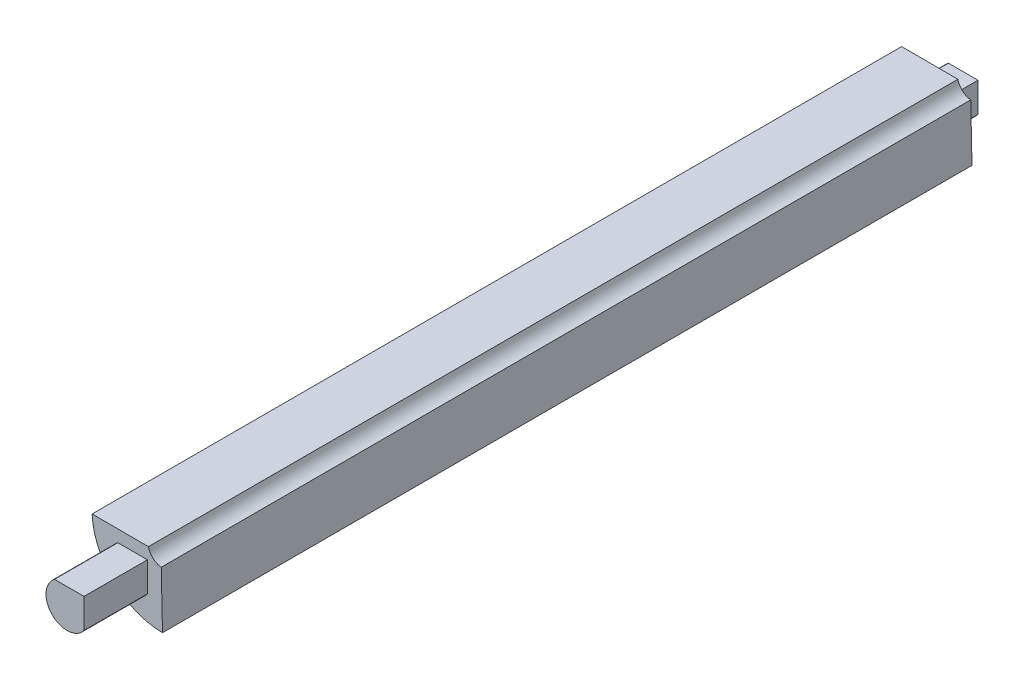
ISO-10303-21;
HEADER;
FILE_DESCRIPTION(('STEP AP214'),'2;1');
FILE_NAME('part.step','',(''),(''),'','','');
FILE_SCHEMA(('AUTOMOTIVE_DESIGN { 1 0 10303 214 1 1 1 1 }'));
ENDSEC;
DATA;
#1=APPLICATION_CONTEXT('core data for automotive mechanical design processes');
#2=APPLICATION_PROTOCOL_DEFINITION('international standard','automotive_design',2000,#1);
#3=PRODUCT_CONTEXT('',#1,'mechanical');
#4=PRODUCT('Part','Part','',(#3));
#5=PRODUCT_RELATED_PRODUCT_CATEGORY('part','',(#4));
#6=PRODUCT_DEFINITION_FORMATION('','',#4);
#7=PRODUCT_DEFINITION_CONTEXT('part definition',#1,'design');
#8=PRODUCT_DEFINITION('design','',#6,#7);
#9=PRODUCT_DEFINITION_SHAPE('','',#8);
#10=(LENGTH_UNIT() NAMED_UNIT(*) SI_UNIT(.MILLI.,.METRE.));
#11=(NAMED_UNIT(*) PLANE_ANGLE_UNIT() SI_UNIT($,.RADIAN.));
#12=(NAMED_UNIT(*) SI_UNIT($,.STERADIAN.) SOLID_ANGLE_UNIT());
#13=UNCERTAINTY_MEASURE_WITH_UNIT(LENGTH_MEASURE(1.E-05),#10,'distance_accuracy_value','');
#14=(GEOMETRIC_REPRESENTATION_CONTEXT(3) GLOBAL_UNCERTAINTY_ASSIGNED_CONTEXT((#13)) GLOBAL_UNIT_ASSIGNED_CONTEXT((#10,
#11,#12)) REPRESENTATION_CONTEXT('',''));
#15=CARTESIAN_POINT('',(0.,0.,0.));
#16=DIRECTION('',(0.,0.,1.));
#17=DIRECTION('',(1.,0.,0.));
#18=AXIS2_PLACEMENT_3D('',#15,#16,#17);
#19=CARTESIAN_POINT('',(4.71363380316695,5.0792632289725,115.));
#20=DIRECTION('',(0.,0.,-1.));
#21=DIRECTION('',(-1.,0.,0.));
#22=AXIS2_PLACEMENT_3D('',#19,#20,#21);
#23=CYLINDRICAL_SURFACE('',#22,10.0492851330422);
#24=CARTESIAN_POINT('',(4.71363380316695,5.0792632289725,0.));
#25=DIRECTION('',(0.,0.,-1.));
#26=DIRECTION('',(-1.,0.,0.));
#27=AXIS2_PLACEMENT_3D('',#24,#25,#26);
#28=CIRCLE('',#27,10.0492851330422);
#29=CARTESIAN_POINT('',(4.67379088573127,-4.96994292012771,0.));
#30=VERTEX_POINT('',#29);
#31=CARTESIAN_POINT('',(-5.32620911426883,4.6437338058589,0.));
#32=VERTEX_POINT('',#31);
#33=EDGE_CURVE('E178',#30,#32,#28,.T.);
#34=ORIENTED_EDGE('',*,*,#33,.F.);
#35=DIRECTION('',(0.,0.,-1.));
#36=VECTOR('',#35,1.);
#37=CARTESIAN_POINT('',(4.67379088573127,-4.96994292012771,115.));
#38=LINE('',#37,#36);
#39=CARTESIAN_POINT('',(4.67379088573127,-4.96994292012771,115.));
#40=VERTEX_POINT('',#39);
#41=EDGE_CURVE('E208',#40,#30,#38,.T.);
#42=ORIENTED_EDGE('',*,*,#41,.F.);
#43=CARTESIAN_POINT('',(4.71363380316695,5.0792632289725,115.));
#44=DIRECTION('',(0.,0.,-1.));
#45=DIRECTION('',(-1.,0.,0.));
#46=AXIS2_PLACEMENT_3D('',#43,#44,#45);
#47=CIRCLE('',#46,10.0492851330422);
#48=CARTESIAN_POINT('',(-5.32620911426883,4.6437338058589,115.));
#49=VERTEX_POINT('',#48);
#50=EDGE_CURVE('E179',#40,#49,#47,.T.);
#51=ORIENTED_EDGE('',*,*,#50,.T.);
#52=DIRECTION('',(0.,0.,-1.));
#53=VECTOR('',#52,1.);
#54=CARTESIAN_POINT('',(-5.32620911426883,4.6437338058589,115.));
#55=LINE('',#54,#53);
#56=EDGE_CURVE('E194',#49,#32,#55,.T.);
#57=ORIENTED_EDGE('',*,*,#56,.T.);
#58=EDGE_LOOP('',(#34,#42,#51,#57));
#59=FACE_BOUND('',#58,.T.);
#60=ADVANCED_FACE('F45',(#59),#23,.T.);
#61=CARTESIAN_POINT('',(4.67379088573127,-4.96994292012771,115.));
#62=DIRECTION('',(-0.999746551843943,-0.0225129313094721,0.));
#63=DIRECTION('',(0.0225129313094721,-0.999746551843944,0.));
#64=AXIS2_PLACEMENT_3D('',#61,#62,#63);
#65=PLANE('',#64);
#66=DIRECTION('',(-0.0225129313094721,0.999746551843944,0.));
#67=VECTOR('',#66,1.);
#68=CARTESIAN_POINT('',(4.67379088573127,-4.96994292012771,0.));
#69=LINE('',#68,#67);
#70=CARTESIAN_POINT('',(4.49430607652267,3.00055708487017,0.));
#71=VERTEX_POINT('',#70);
#72=EDGE_CURVE('E184',#30,#71,#69,.T.);
#73=ORIENTED_EDGE('',*,*,#72,.T.);
#74=DIRECTION('',(0.,0.,-1.));
#75=VECTOR('',#74,1.);
#76=CARTESIAN_POINT('',(4.49430607652267,3.00055708487017,115.));
#77=LINE('',#76,#75);
#78=CARTESIAN_POINT('',(4.49430607652267,3.00055708487017,115.));
#79=VERTEX_POINT('',#78);
#80=EDGE_CURVE('E212',#79,#71,#77,.T.);
#81=ORIENTED_EDGE('',*,*,#80,.F.);
#82=DIRECTION('',(-0.0225129313094721,0.999746551843944,0.));
#83=VECTOR('',#82,1.);
#84=CARTESIAN_POINT('',(4.67379088573127,-4.96994292012771,115.));
#85=LINE('',#84,#83);
#86=EDGE_CURVE('E191',#40,#79,#85,.T.);
#87=ORIENTED_EDGE('',*,*,#86,.F.);
#88=ORIENTED_EDGE('',*,*,#41,.T.);
#89=EDGE_LOOP('',(#73,#81,#87,#88));
#90=FACE_BOUND('',#89,.T.);
#91=ADVANCED_FACE('F256',(#90),#65,.F.);
#92=CARTESIAN_POINT('',(4.71363380316695,5.0792632289725,115.));
#93=DIRECTION('',(0.,0.,-1.));
#94=DIRECTION('',(-1.,0.,0.));
#95=AXIS2_PLACEMENT_3D('',#92,#93,#94);
#96=CYLINDRICAL_SURFACE('',#95,2.09024493426099);
#97=CARTESIAN_POINT('',(4.71363380316695,5.0792632289725,0.));
#98=DIRECTION('',(0.,0.,-1.));
#99=DIRECTION('',(-1.,0.,0.));
#100=AXIS2_PLACEMENT_3D('',#97,#98,#99);
#101=CIRCLE('',#100,2.09024493426099);
#102=CARTESIAN_POINT('',(2.67376435620369,4.62313109400549,0.));
#103=VERTEX_POINT('',#102);
#104=EDGE_CURVE('E202',#71,#103,#101,.T.);
#105=ORIENTED_EDGE('',*,*,#104,.T.);
#106=DIRECTION('',(0.,0.,-1.));
#107=VECTOR('',#106,1.);
#108=CARTESIAN_POINT('',(2.67376435620369,4.62313109400549,115.));
#109=LINE('',#108,#107);
#110=CARTESIAN_POINT('',(2.67376435620369,4.62313109400549,115.));
#111=VERTEX_POINT('',#110);
#112=EDGE_CURVE('E216',#111,#103,#109,.T.);
#113=ORIENTED_EDGE('',*,*,#112,.F.);
#114=CARTESIAN_POINT('',(4.71363380316695,5.0792632289725,115.));
#115=DIRECTION('',(0.,0.,-1.));
#116=DIRECTION('',(-1.,0.,0.));
#117=AXIS2_PLACEMENT_3D('',#114,#115,#116);
#118=CIRCLE('',#117,2.09024493426099);
#119=EDGE_CURVE('E188',#79,#111,#118,.T.);
#120=ORIENTED_EDGE('',*,*,#119,.F.);
#121=ORIENTED_EDGE('',*,*,#80,.T.);
#122=EDGE_LOOP('',(#105,#113,#120,#121));
#123=FACE_BOUND('',#122,.T.);
#124=ADVANCED_FACE('F253',(#123),#96,.F.);
#125=CARTESIAN_POINT('',(-5.32620911426883,4.6437338058589,115.));
#126=DIRECTION('',(0.00257533898167573,0.999996683809066,0.));
#127=DIRECTION('',(-0.999996683809066,0.00257533898167573,0.));
#128=AXIS2_PLACEMENT_3D('',#125,#126,#127);
#129=PLANE('',#128);
#130=DIRECTION('',(0.999996683809066,-0.00257533898167573,0.));
#131=VECTOR('',#130,1.);
#132=CARTESIAN_POINT('',(-5.32620911426883,4.6437338058589,0.));
#133=LINE('',#132,#131);
#134=EDGE_CURVE('E198',#32,#103,#133,.T.);
#135=ORIENTED_EDGE('',*,*,#134,.F.);
#136=ORIENTED_EDGE('',*,*,#56,.F.);
#137=DIRECTION('',(0.999996683809066,-0.00257533898167573,0.));
#138=VECTOR('',#137,1.);
#139=CARTESIAN_POINT('',(-5.32620911426883,4.6437338058589,115.));
#140=LINE('',#139,#138);
#141=EDGE_CURVE('E183',#49,#111,#140,.T.);
#142=ORIENTED_EDGE('',*,*,#141,.T.);
#143=ORIENTED_EDGE('',*,*,#112,.T.);
#144=EDGE_LOOP('',(#135,#136,#142,#143));
#145=FACE_BOUND('',#144,.T.);
#146=ADVANCED_FACE('F249',(#145),#129,.T.);
#147=CARTESIAN_POINT('',(4.71363380316695,5.0792632289725,115.));
#148=DIRECTION('',(0.,0.,-1.));
#149=DIRECTION('',(-1.,0.,0.));
#150=AXIS2_PLACEMENT_3D('',#147,#148,#149);
#151=PLANE('',#150);
#152=DIRECTION('',(0.,-1.,0.));
#153=VECTOR('',#152,1.);
#154=CARTESIAN_POINT('',(2.52635533085661,5.0792632289725,115.));
#155=LINE('',#154,#153);
#156=CARTESIAN_POINT('',(2.52635533085661,2.92986091113323,115.));
#157=VERTEX_POINT('',#156);
#158=CARTESIAN_POINT('',(2.52635533085661,-1.27013908886677,115.));
#159=VERTEX_POINT('',#158);
#160=EDGE_CURVE('E162',#157,#159,#155,.T.);
#161=ORIENTED_EDGE('',*,*,#160,.T.);
#162=CARTESIAN_POINT('',(0.120338903685447,0.523844483962063,115.));
#163=DIRECTION('',(0.,0.,-1.));
#164=DIRECTION('',(-1.,0.,0.));
#165=AXIS2_PLACEMENT_3D('',#162,#163,#164);
#166=CIRCLE('',#165,3.00121510515278);
#167=CARTESIAN_POINT('',(-1.67364466914339,2.92986091113323,115.));
#168=VERTEX_POINT('',#167);
#169=EDGE_CURVE('E124',#159,#168,#166,.T.);
#170=ORIENTED_EDGE('',*,*,#169,.T.);
#171=DIRECTION('',(1.,0.,0.));
#172=VECTOR('',#171,1.);
#173=CARTESIAN_POINT('',(4.71363380316695,2.92986091113323,115.));
#174=LINE('',#173,#172);
#175=EDGE_CURVE('E172',#168,#157,#174,.T.);
#176=ORIENTED_EDGE('',*,*,#175,.T.);
#177=EDGE_LOOP('',(#161,#170,#176));
#178=FACE_BOUND('',#177,.T.);
#179=ORIENTED_EDGE('',*,*,#50,.F.);
#180=ORIENTED_EDGE('',*,*,#86,.T.);
#181=ORIENTED_EDGE('',*,*,#119,.T.);
#182=ORIENTED_EDGE('',*,*,#141,.F.);
#183=EDGE_LOOP('',(#179,#180,#181,#182));
#184=FACE_BOUND('',#183,.T.);
#185=ADVANCED_FACE('F238',(#178,#184),#151,.F.);
#186=CARTESIAN_POINT('',(4.71363380316695,5.0792632289725,0.));
#187=DIRECTION('',(0.,0.,-1.));
#188=DIRECTION('',(-1.,0.,0.));
#189=AXIS2_PLACEMENT_3D('',#186,#187,#188);
#190=PLANE('',#189);
#191=CARTESIAN_POINT('',(0.120338903685447,0.523844483962063,0.));
#192=DIRECTION('',(0.,0.,-1.));
#193=DIRECTION('',(-1.,0.,0.));
#194=AXIS2_PLACEMENT_3D('',#191,#192,#193);
#195=CIRCLE('',#194,3.00121510515278);
#196=CARTESIAN_POINT('',(2.52635533085661,-1.27013908886677,0.));
#197=VERTEX_POINT('',#196);
#198=CARTESIAN_POINT('',(-1.67364466914339,2.92986091113323,0.));
#199=VERTEX_POINT('',#198);
#200=EDGE_CURVE('E11',#197,#199,#195,.T.);
#201=ORIENTED_EDGE('',*,*,#200,.F.);
#202=DIRECTION('',(0.,-1.,0.));
#203=VECTOR('',#202,1.);
#204=CARTESIAN_POINT('',(2.52635533085661,5.0792632289725,0.));
#205=LINE('',#204,#203);
#206=CARTESIAN_POINT('',(2.52635533085661,2.92986091113323,0.));
#207=VERTEX_POINT('',#206);
#208=EDGE_CURVE('E211',#207,#197,#205,.T.);
#209=ORIENTED_EDGE('',*,*,#208,.F.);
#210=DIRECTION('',(1.,0.,0.));
#211=VECTOR('',#210,1.);
#212=CARTESIAN_POINT('',(4.71363380316695,2.92986091113323,0.));
#213=LINE('',#212,#211);
#214=EDGE_CURVE('E53',#199,#207,#213,.T.);
#215=ORIENTED_EDGE('',*,*,#214,.F.);
#216=EDGE_LOOP('',(#201,#209,#215));
#217=FACE_BOUND('',#216,.T.);
#218=ORIENTED_EDGE('',*,*,#33,.T.);
#219=ORIENTED_EDGE('',*,*,#134,.T.);
#220=ORIENTED_EDGE('',*,*,#104,.F.);
#221=ORIENTED_EDGE('',*,*,#72,.F.);
#222=EDGE_LOOP('',(#218,#219,#220,#221));
#223=FACE_BOUND('',#222,.T.);
#224=ADVANCED_FACE('F235',(#217,#223),#190,.T.);
#225=CARTESIAN_POINT('',(0.120338903685447,0.523844483962063,-2.99999999999999));
#226=DIRECTION('',(0.,0.,-1.));
#227=DIRECTION('',(-1.,0.,0.));
#228=AXIS2_PLACEMENT_3D('',#225,#226,#227);
#229=PLANE('',#228);
#230=CARTESIAN_POINT('',(0.120338903685447,0.523844483962063,-2.99999999999999));
#231=DIRECTION('',(0.,0.,1.));
#232=DIRECTION('',(-1.,0.,0.));
#233=AXIS2_PLACEMENT_3D('',#230,#231,#232);
#234=CIRCLE('',#233,3.00121510515278);
#235=CARTESIAN_POINT('',(-1.67364466914339,2.92986091113323,-2.99999999999999));
#236=VERTEX_POINT('',#235);
#237=CARTESIAN_POINT('',(2.52635533085661,-1.27013908886677,-2.99999999999999));
#238=VERTEX_POINT('',#237);
#239=EDGE_CURVE('E147',#236,#238,#234,.T.);
#240=ORIENTED_EDGE('',*,*,#239,.F.);
#241=DIRECTION('',(-1.,0.,0.));
#242=VECTOR('',#241,1.);
#243=CARTESIAN_POINT('',(-1.67364466914339,2.92986091113323,-2.99999999999999));
#244=LINE('',#243,#242);
#245=CARTESIAN_POINT('',(2.52635533085661,2.92986091113323,-2.99999999999999));
#246=VERTEX_POINT('',#245);
#247=EDGE_CURVE('E128',#246,#236,#244,.T.);
#248=ORIENTED_EDGE('',*,*,#247,.F.);
#249=DIRECTION('',(0.,1.,0.));
#250=VECTOR('',#249,1.);
#251=CARTESIAN_POINT('',(2.52635533085661,2.92986091113323,-2.99999999999999));
#252=LINE('',#251,#250);
#253=EDGE_CURVE('E151',#238,#246,#252,.T.);
#254=ORIENTED_EDGE('',*,*,#253,.F.);
#255=EDGE_LOOP('',(#240,#248,#254));
#256=FACE_BOUND('',#255,.T.);
#257=ADVANCED_FACE('F232',(#256),#229,.T.);
#258=CARTESIAN_POINT('',(2.52635533085661,2.92986091113323,-2.99999999999999));
#259=DIRECTION('',(1.,0.,0.));
#260=DIRECTION('',(0.,0.,-1.));
#261=AXIS2_PLACEMENT_3D('',#258,#259,#260);
#262=PLANE('',#261);
#263=DIRECTION('',(0.,0.,1.));
#264=VECTOR('',#263,1.);
#265=CARTESIAN_POINT('',(2.52635533085661,2.92986091113323,-2.99999999999999));
#266=LINE('',#265,#264);
#267=EDGE_CURVE('E164',#246,#207,#266,.T.);
#268=ORIENTED_EDGE('',*,*,#267,.T.);
#269=ORIENTED_EDGE('',*,*,#208,.T.);
#270=DIRECTION('',(0.,0.,1.));
#271=VECTOR('',#270,1.);
#272=CARTESIAN_POINT('',(2.52635533085661,-1.27013908886677,-2.99999999999999));
#273=LINE('',#272,#271);
#274=EDGE_CURVE('E127',#238,#197,#273,.T.);
#275=ORIENTED_EDGE('',*,*,#274,.F.);
#276=ORIENTED_EDGE('',*,*,#253,.T.);
#277=EDGE_LOOP('',(#268,#269,#275,#276));
#278=FACE_BOUND('',#277,.T.);
#279=ADVANCED_FACE('F227',(#278),#262,.T.);
#280=CARTESIAN_POINT('',(-1.67364466914339,2.92986091113323,-2.99999999999999));
#281=DIRECTION('',(0.,1.,0.));
#282=DIRECTION('',(0.,0.,1.));
#283=AXIS2_PLACEMENT_3D('',#280,#281,#282);
#284=PLANE('',#283);
#285=DIRECTION('',(0.,0.,1.));
#286=VECTOR('',#285,1.);
#287=CARTESIAN_POINT('',(-1.67364466914339,2.92986091113323,-2.99999999999999));
#288=LINE('',#287,#286);
#289=EDGE_CURVE('E158',#236,#199,#288,.T.);
#290=ORIENTED_EDGE('',*,*,#289,.T.);
#291=ORIENTED_EDGE('',*,*,#214,.T.);
#292=ORIENTED_EDGE('',*,*,#267,.F.);
#293=ORIENTED_EDGE('',*,*,#247,.T.);
#294=EDGE_LOOP('',(#290,#291,#292,#293));
#295=FACE_BOUND('',#294,.T.);
#296=ADVANCED_FACE('F225',(#295),#284,.T.);
#297=CARTESIAN_POINT('',(0.120338903685447,0.523844483962063,-2.99999999999999));
#298=DIRECTION('',(0.,0.,1.));
#299=DIRECTION('',(1.,0.,0.));
#300=AXIS2_PLACEMENT_3D('',#297,#298,#299);
#301=CYLINDRICAL_SURFACE('',#300,3.00121510515278);
#302=ORIENTED_EDGE('',*,*,#274,.T.);
#303=ORIENTED_EDGE('',*,*,#200,.T.);
#304=ORIENTED_EDGE('',*,*,#289,.F.);
#305=ORIENTED_EDGE('',*,*,#239,.T.);
#306=EDGE_LOOP('',(#302,#303,#304,#305));
#307=FACE_BOUND('',#306,.T.);
#308=ADVANCED_FACE('F234',(#307),#301,.T.);
#309=ORIENTED_EDGE('',*,*,#169,.F.);
#310=CARTESIAN_POINT('',(2.52635533085661,-1.27013908886677,124.));
#311=VERTEX_POINT('',#310);
#312=EDGE_CURVE('E60',#159,#311,#273,.T.);
#313=ORIENTED_EDGE('',*,*,#312,.T.);
#314=CARTESIAN_POINT('',(0.120338903685447,0.523844483962063,124.));
#315=DIRECTION('',(0.,0.,1.));
#316=DIRECTION('',(-1.,0.,0.));
#317=AXIS2_PLACEMENT_3D('',#314,#315,#316);
#318=CIRCLE('',#317,3.00121510515278);
#319=CARTESIAN_POINT('',(-1.67364466914339,2.92986091113323,124.));
#320=VERTEX_POINT('',#319);
#321=EDGE_CURVE('E122',#320,#311,#318,.T.);
#322=ORIENTED_EDGE('',*,*,#321,.F.);
#323=EDGE_CURVE('E163',#168,#320,#288,.T.);
#324=ORIENTED_EDGE('',*,*,#323,.F.);
#325=EDGE_LOOP('',(#309,#313,#322,#324));
#326=FACE_BOUND('',#325,.T.);
#327=ADVANCED_FACE('F119',(#326),#301,.T.);
#328=ORIENTED_EDGE('',*,*,#175,.F.);
#329=ORIENTED_EDGE('',*,*,#323,.T.);
#330=DIRECTION('',(-1.,0.,0.));
#331=VECTOR('',#330,1.);
#332=CARTESIAN_POINT('',(-1.67364466914339,2.92986091113323,124.));
#333=LINE('',#332,#331);
#334=CARTESIAN_POINT('',(2.52635533085661,2.92986091113323,124.));
#335=VERTEX_POINT('',#334);
#336=EDGE_CURVE('E139',#335,#320,#333,.T.);
#337=ORIENTED_EDGE('',*,*,#336,.F.);
#338=EDGE_CURVE('E134',#157,#335,#266,.T.);
#339=ORIENTED_EDGE('',*,*,#338,.F.);
#340=EDGE_LOOP('',(#328,#329,#337,#339));
#341=FACE_BOUND('',#340,.T.);
#342=ADVANCED_FACE('F318',(#341),#284,.T.);
#343=ORIENTED_EDGE('',*,*,#160,.F.);
#344=ORIENTED_EDGE('',*,*,#338,.T.);
#345=DIRECTION('',(0.,1.,0.));
#346=VECTOR('',#345,1.);
#347=CARTESIAN_POINT('',(2.52635533085661,2.92986091113323,124.));
#348=LINE('',#347,#346);
#349=EDGE_CURVE('E131',#311,#335,#348,.T.);
#350=ORIENTED_EDGE('',*,*,#349,.F.);
#351=ORIENTED_EDGE('',*,*,#312,.F.);
#352=EDGE_LOOP('',(#343,#344,#350,#351));
#353=FACE_BOUND('',#352,.T.);
#354=ADVANCED_FACE('F132',(#353),#262,.T.);
#355=CARTESIAN_POINT('',(0.120338903685447,0.523844483962063,124.));
#356=DIRECTION('',(0.,0.,-1.));
#357=DIRECTION('',(-1.,0.,0.));
#358=AXIS2_PLACEMENT_3D('',#355,#356,#357);
#359=PLANE('',#358);
#360=ORIENTED_EDGE('',*,*,#321,.T.);
#361=ORIENTED_EDGE('',*,*,#349,.T.);
#362=ORIENTED_EDGE('',*,*,#336,.T.);
#363=EDGE_LOOP('',(#360,#361,#362));
#364=FACE_BOUND('',#363,.T.);
#365=ADVANCED_FACE('F141',(#364),#359,.F.);
#366=CLOSED_SHELL('',(#60,#91,#124,#146,#185,#224,#257,#279,#296,#308,#327,#342,#354,#365));
#367=MANIFOLD_SOLID_BREP('B2',#366);
#368=ADVANCED_BREP_SHAPE_REPRESENTATION('',(#18,#367),#14);
#369=SHAPE_DEFINITION_REPRESENTATION(#9,#368);
ENDSEC;
END-ISO-10303-21;
